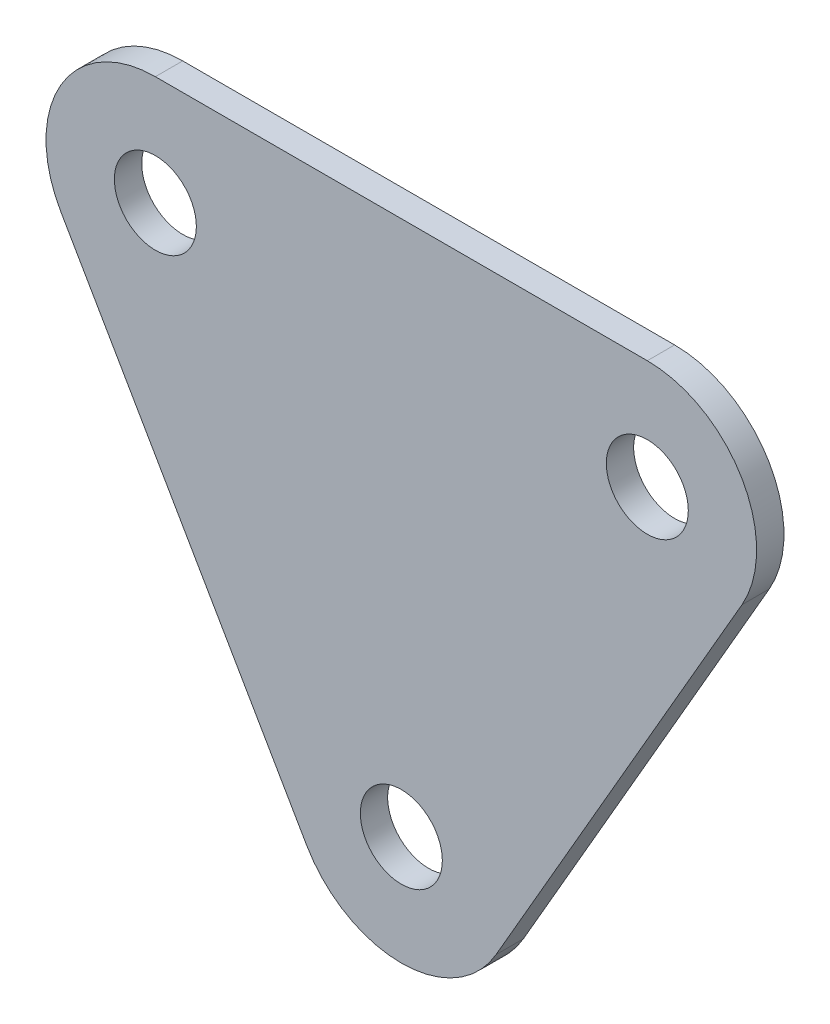
ISO-10303-21;
HEADER;
FILE_DESCRIPTION(('STEP AP214'),'2;1');
FILE_NAME('part.step','',(''),(''),'','','');
FILE_SCHEMA(('AUTOMOTIVE_DESIGN { 1 0 10303 214 1 1 1 1 }'));
ENDSEC;
DATA;
#1=APPLICATION_CONTEXT('core data for automotive mechanical design processes');
#2=APPLICATION_PROTOCOL_DEFINITION('international standard','automotive_design',2000,#1);
#3=PRODUCT_CONTEXT('',#1,'mechanical');
#4=PRODUCT('Part','Part','',(#3));
#5=PRODUCT_RELATED_PRODUCT_CATEGORY('part','',(#4));
#6=PRODUCT_DEFINITION_FORMATION('','',#4);
#7=PRODUCT_DEFINITION_CONTEXT('part definition',#1,'design');
#8=PRODUCT_DEFINITION('design','',#6,#7);
#9=PRODUCT_DEFINITION_SHAPE('','',#8);
#10=(LENGTH_UNIT() NAMED_UNIT(*) SI_UNIT(.MILLI.,.METRE.));
#11=(NAMED_UNIT(*) PLANE_ANGLE_UNIT() SI_UNIT($,.RADIAN.));
#12=(NAMED_UNIT(*) SI_UNIT($,.STERADIAN.) SOLID_ANGLE_UNIT());
#13=UNCERTAINTY_MEASURE_WITH_UNIT(LENGTH_MEASURE(1.E-05),#10,'distance_accuracy_value','');
#14=(GEOMETRIC_REPRESENTATION_CONTEXT(3) GLOBAL_UNCERTAINTY_ASSIGNED_CONTEXT((#13)) GLOBAL_UNIT_ASSIGNED_CONTEXT((#10,
#11,#12)) REPRESENTATION_CONTEXT('',''));
#15=CARTESIAN_POINT('',(0.,0.,0.));
#16=DIRECTION('',(0.,0.,1.));
#17=DIRECTION('',(1.,0.,0.));
#18=AXIS2_PLACEMENT_3D('',#15,#16,#17);
#19=CARTESIAN_POINT('',(-2.63677968348475E-13,-80.,20.));
#20=DIRECTION('',(0.,0.,-1.));
#21=DIRECTION('',(-1.,0.,0.));
#22=AXIS2_PLACEMENT_3D('',#19,#20,#21);
#23=PLANE('',#22);
#24=CARTESIAN_POINT('',(-2.63677968348475E-13,-80.,20.));
#25=DIRECTION('',(0.,0.,1.));
#26=DIRECTION('',(-1.,0.,0.));
#27=AXIS2_PLACEMENT_3D('',#24,#25,#26);
#28=CIRCLE('',#27,80.);
#29=CARTESIAN_POINT('',(0.,0.,20.));
#30=VERTEX_POINT('',#29);
#31=CARTESIAN_POINT('',(-69.2820323027554,-120.,20.));
#32=VERTEX_POINT('',#31);
#33=EDGE_CURVE('E129',#30,#32,#28,.T.);
#34=ORIENTED_EDGE('',*,*,#33,.T.);
#35=DIRECTION('',(0.5,-0.866025403784438,0.));
#36=VECTOR('',#35,1.);
#37=CARTESIAN_POINT('',(110.717967697245,-431.769145362398,20.));
#38=LINE('',#37,#36);
#39=CARTESIAN_POINT('',(110.717967697245,-431.769145362398,20.));
#40=VERTEX_POINT('',#39);
#41=EDGE_CURVE('E87',#32,#40,#38,.T.);
#42=ORIENTED_EDGE('',*,*,#41,.T.);
#43=CARTESIAN_POINT('',(180.,-391.769145362398,20.));
#44=DIRECTION('',(0.,0.,1.));
#45=DIRECTION('',(-1.,0.,0.));
#46=AXIS2_PLACEMENT_3D('',#43,#44,#45);
#47=CIRCLE('',#46,80.);
#48=CARTESIAN_POINT('',(249.282032302755,-431.769145362398,20.));
#49=VERTEX_POINT('',#48);
#50=EDGE_CURVE('E100',#40,#49,#47,.T.);
#51=ORIENTED_EDGE('',*,*,#50,.T.);
#52=DIRECTION('',(0.500000000000001,0.866025403784438,0.));
#53=VECTOR('',#52,1.);
#54=CARTESIAN_POINT('',(429.282032302755,-120.,20.));
#55=LINE('',#54,#53);
#56=CARTESIAN_POINT('',(429.282032302755,-120.,20.));
#57=VERTEX_POINT('',#56);
#58=EDGE_CURVE('E94',#49,#57,#55,.T.);
#59=ORIENTED_EDGE('',*,*,#58,.T.);
#60=CARTESIAN_POINT('',(360.,-80.,20.));
#61=DIRECTION('',(0.,0.,1.));
#62=DIRECTION('',(-1.,0.,0.));
#63=AXIS2_PLACEMENT_3D('',#60,#61,#62);
#64=CIRCLE('',#63,80.);
#65=CARTESIAN_POINT('',(360.,0.,20.));
#66=VERTEX_POINT('',#65);
#67=EDGE_CURVE('E98',#57,#66,#64,.T.);
#68=ORIENTED_EDGE('',*,*,#67,.T.);
#69=DIRECTION('',(-1.,0.,0.));
#70=VECTOR('',#69,1.);
#71=CARTESIAN_POINT('',(0.,0.,20.));
#72=LINE('',#71,#70);
#73=EDGE_CURVE('E50',#66,#30,#72,.T.);
#74=ORIENTED_EDGE('',*,*,#73,.T.);
#75=EDGE_LOOP('',(#34,#42,#51,#59,#68,#74));
#76=FACE_BOUND('',#75,.T.);
#77=CARTESIAN_POINT('',(-2.63677968348475E-13,-80.,20.));
#78=DIRECTION('',(0.,0.,1.));
#79=DIRECTION('',(1.,0.,0.));
#80=AXIS2_PLACEMENT_3D('',#77,#78,#79);
#81=CIRCLE('',#80,30.);
#82=CARTESIAN_POINT('',(29.9999999999997,-80.,20.));
#83=VERTEX_POINT('',#82);
#84=EDGE_CURVE('E122',#83,#83,#81,.T.);
#85=ORIENTED_EDGE('',*,*,#84,.F.);
#86=EDGE_LOOP('',(#85));
#87=FACE_BOUND('',#86,.T.);
#88=CARTESIAN_POINT('',(360.,-80.,20.));
#89=DIRECTION('',(0.,0.,1.));
#90=DIRECTION('',(1.,0.,0.));
#91=AXIS2_PLACEMENT_3D('',#88,#89,#90);
#92=CIRCLE('',#91,30.);
#93=CARTESIAN_POINT('',(390.,-80.,20.));
#94=VERTEX_POINT('',#93);
#95=EDGE_CURVE('E183',#94,#94,#92,.T.);
#96=ORIENTED_EDGE('',*,*,#95,.F.);
#97=EDGE_LOOP('',(#96));
#98=FACE_BOUND('',#97,.T.);
#99=CARTESIAN_POINT('',(180.,-391.769145362398,20.));
#100=DIRECTION('',(0.,0.,1.));
#101=DIRECTION('',(1.,0.,0.));
#102=AXIS2_PLACEMENT_3D('',#99,#100,#101);
#103=CIRCLE('',#102,30.);
#104=CARTESIAN_POINT('',(210.,-391.769145362398,20.));
#105=VERTEX_POINT('',#104);
#106=EDGE_CURVE('E174',#105,#105,#103,.T.);
#107=ORIENTED_EDGE('',*,*,#106,.F.);
#108=EDGE_LOOP('',(#107));
#109=FACE_BOUND('',#108,.T.);
#110=ADVANCED_FACE('F33',(#76,#87,#98,#109),#23,.F.);
#111=CARTESIAN_POINT('',(-2.63677968348475E-13,-80.,0.));
#112=DIRECTION('',(0.,0.,-1.));
#113=DIRECTION('',(-1.,0.,0.));
#114=AXIS2_PLACEMENT_3D('',#111,#112,#113);
#115=PLANE('',#114);
#116=CARTESIAN_POINT('',(360.,-80.,0.));
#117=DIRECTION('',(0.,0.,1.));
#118=DIRECTION('',(1.,0.,0.));
#119=AXIS2_PLACEMENT_3D('',#116,#117,#118);
#120=CIRCLE('',#119,30.);
#121=CARTESIAN_POINT('',(390.,-80.,0.));
#122=VERTEX_POINT('',#121);
#123=EDGE_CURVE('E180',#122,#122,#120,.T.);
#124=ORIENTED_EDGE('',*,*,#123,.T.);
#125=EDGE_LOOP('',(#124));
#126=FACE_BOUND('',#125,.T.);
#127=CARTESIAN_POINT('',(-2.63677968348475E-13,-80.,0.));
#128=DIRECTION('',(0.,0.,1.));
#129=DIRECTION('',(-1.,0.,0.));
#130=AXIS2_PLACEMENT_3D('',#127,#128,#129);
#131=CIRCLE('',#130,80.);
#132=CARTESIAN_POINT('',(0.,0.,0.));
#133=VERTEX_POINT('',#132);
#134=CARTESIAN_POINT('',(-69.2820323027554,-120.,0.));
#135=VERTEX_POINT('',#134);
#136=EDGE_CURVE('E118',#133,#135,#131,.T.);
#137=ORIENTED_EDGE('',*,*,#136,.F.);
#138=DIRECTION('',(-1.,0.,0.));
#139=VECTOR('',#138,1.);
#140=CARTESIAN_POINT('',(0.,0.,0.));
#141=LINE('',#140,#139);
#142=CARTESIAN_POINT('',(360.,0.,0.));
#143=VERTEX_POINT('',#142);
#144=EDGE_CURVE('E79',#143,#133,#141,.T.);
#145=ORIENTED_EDGE('',*,*,#144,.F.);
#146=CARTESIAN_POINT('',(360.,-80.,0.));
#147=DIRECTION('',(0.,0.,1.));
#148=DIRECTION('',(-1.,0.,0.));
#149=AXIS2_PLACEMENT_3D('',#146,#147,#148);
#150=CIRCLE('',#149,80.);
#151=CARTESIAN_POINT('',(429.282032302755,-120.,0.));
#152=VERTEX_POINT('',#151);
#153=EDGE_CURVE('E73',#152,#143,#150,.T.);
#154=ORIENTED_EDGE('',*,*,#153,.F.);
#155=DIRECTION('',(0.500000000000001,0.866025403784438,0.));
#156=VECTOR('',#155,1.);
#157=CARTESIAN_POINT('',(429.282032302755,-120.,0.));
#158=LINE('',#157,#156);
#159=CARTESIAN_POINT('',(249.282032302755,-431.769145362398,0.));
#160=VERTEX_POINT('',#159);
#161=EDGE_CURVE('E108',#160,#152,#158,.T.);
#162=ORIENTED_EDGE('',*,*,#161,.F.);
#163=CARTESIAN_POINT('',(180.,-391.769145362398,0.));
#164=DIRECTION('',(0.,0.,1.));
#165=DIRECTION('',(-1.,0.,0.));
#166=AXIS2_PLACEMENT_3D('',#163,#164,#165);
#167=CIRCLE('',#166,80.);
#168=CARTESIAN_POINT('',(110.717967697245,-431.769145362398,0.));
#169=VERTEX_POINT('',#168);
#170=EDGE_CURVE('E124',#169,#160,#167,.T.);
#171=ORIENTED_EDGE('',*,*,#170,.F.);
#172=DIRECTION('',(0.5,-0.866025403784438,0.));
#173=VECTOR('',#172,1.);
#174=CARTESIAN_POINT('',(110.717967697245,-431.769145362398,0.));
#175=LINE('',#174,#173);
#176=EDGE_CURVE('E121',#135,#169,#175,.T.);
#177=ORIENTED_EDGE('',*,*,#176,.F.);
#178=EDGE_LOOP('',(#137,#145,#154,#162,#171,#177));
#179=FACE_BOUND('',#178,.T.);
#180=CARTESIAN_POINT('',(-2.63677968348475E-13,-80.,0.));
#181=DIRECTION('',(0.,0.,1.));
#182=DIRECTION('',(1.,0.,0.));
#183=AXIS2_PLACEMENT_3D('',#180,#181,#182);
#184=CIRCLE('',#183,30.);
#185=CARTESIAN_POINT('',(29.9999999999997,-80.,0.));
#186=VERTEX_POINT('',#185);
#187=EDGE_CURVE('E186',#186,#186,#184,.T.);
#188=ORIENTED_EDGE('',*,*,#187,.T.);
#189=EDGE_LOOP('',(#188));
#190=FACE_BOUND('',#189,.T.);
#191=CARTESIAN_POINT('',(180.,-391.769145362398,0.));
#192=DIRECTION('',(0.,0.,1.));
#193=DIRECTION('',(1.,0.,0.));
#194=AXIS2_PLACEMENT_3D('',#191,#192,#193);
#195=CIRCLE('',#194,30.);
#196=CARTESIAN_POINT('',(210.,-391.769145362398,0.));
#197=VERTEX_POINT('',#196);
#198=EDGE_CURVE('E177',#197,#197,#195,.T.);
#199=ORIENTED_EDGE('',*,*,#198,.T.);
#200=EDGE_LOOP('',(#199));
#201=FACE_BOUND('',#200,.T.);
#202=ADVANCED_FACE('F138',(#126,#179,#190,#201),#115,.T.);
#203=CARTESIAN_POINT('',(-2.63677968348475E-13,-80.,20.));
#204=DIRECTION('',(0.,0.,-1.));
#205=DIRECTION('',(-1.,0.,0.));
#206=AXIS2_PLACEMENT_3D('',#203,#204,#205);
#207=CYLINDRICAL_SURFACE('',#206,80.);
#208=ORIENTED_EDGE('',*,*,#136,.T.);
#209=DIRECTION('',(0.,0.,-1.));
#210=VECTOR('',#209,1.);
#211=CARTESIAN_POINT('',(-69.2820323027554,-120.,20.));
#212=LINE('',#211,#210);
#213=EDGE_CURVE('E11',#32,#135,#212,.T.);
#214=ORIENTED_EDGE('',*,*,#213,.F.);
#215=ORIENTED_EDGE('',*,*,#33,.F.);
#216=DIRECTION('',(0.,0.,-1.));
#217=VECTOR('',#216,1.);
#218=CARTESIAN_POINT('',(0.,0.,20.));
#219=LINE('',#218,#217);
#220=EDGE_CURVE('E114',#30,#133,#219,.T.);
#221=ORIENTED_EDGE('',*,*,#220,.T.);
#222=EDGE_LOOP('',(#208,#214,#215,#221));
#223=FACE_BOUND('',#222,.T.);
#224=ADVANCED_FACE('F35',(#223),#207,.T.);
#225=CARTESIAN_POINT('',(110.717967697245,-431.769145362398,20.));
#226=DIRECTION('',(0.866025403784438,0.5,0.));
#227=DIRECTION('',(-0.5,0.866025403784438,0.));
#228=AXIS2_PLACEMENT_3D('',#225,#226,#227);
#229=PLANE('',#228);
#230=ORIENTED_EDGE('',*,*,#176,.T.);
#231=DIRECTION('',(0.,0.,-1.));
#232=VECTOR('',#231,1.);
#233=CARTESIAN_POINT('',(110.717967697245,-431.769145362398,20.));
#234=LINE('',#233,#232);
#235=EDGE_CURVE('E42',#40,#169,#234,.T.);
#236=ORIENTED_EDGE('',*,*,#235,.F.);
#237=ORIENTED_EDGE('',*,*,#41,.F.);
#238=ORIENTED_EDGE('',*,*,#213,.T.);
#239=EDGE_LOOP('',(#230,#236,#237,#238));
#240=FACE_BOUND('',#239,.T.);
#241=ADVANCED_FACE('F237',(#240),#229,.F.);
#242=CARTESIAN_POINT('',(180.,-391.769145362398,20.));
#243=DIRECTION('',(0.,0.,-1.));
#244=DIRECTION('',(-1.,0.,0.));
#245=AXIS2_PLACEMENT_3D('',#242,#243,#244);
#246=CYLINDRICAL_SURFACE('',#245,80.);
#247=ORIENTED_EDGE('',*,*,#170,.T.);
#248=DIRECTION('',(0.,0.,-1.));
#249=VECTOR('',#248,1.);
#250=CARTESIAN_POINT('',(249.282032302755,-431.769145362398,20.));
#251=LINE('',#250,#249);
#252=EDGE_CURVE('E109',#49,#160,#251,.T.);
#253=ORIENTED_EDGE('',*,*,#252,.F.);
#254=ORIENTED_EDGE('',*,*,#50,.F.);
#255=ORIENTED_EDGE('',*,*,#235,.T.);
#256=EDGE_LOOP('',(#247,#253,#254,#255));
#257=FACE_BOUND('',#256,.T.);
#258=ADVANCED_FACE('F135',(#257),#246,.T.);
#259=CARTESIAN_POINT('',(429.282032302755,-120.,20.));
#260=DIRECTION('',(-0.866025403784438,0.500000000000001,0.));
#261=DIRECTION('',(-0.500000000000001,-0.866025403784438,0.));
#262=AXIS2_PLACEMENT_3D('',#259,#260,#261);
#263=PLANE('',#262);
#264=ORIENTED_EDGE('',*,*,#161,.T.);
#265=DIRECTION('',(0.,0.,-1.));
#266=VECTOR('',#265,1.);
#267=CARTESIAN_POINT('',(429.282032302755,-120.,20.));
#268=LINE('',#267,#266);
#269=EDGE_CURVE('E105',#57,#152,#268,.T.);
#270=ORIENTED_EDGE('',*,*,#269,.F.);
#271=ORIENTED_EDGE('',*,*,#58,.F.);
#272=ORIENTED_EDGE('',*,*,#252,.T.);
#273=EDGE_LOOP('',(#264,#270,#271,#272));
#274=FACE_BOUND('',#273,.T.);
#275=ADVANCED_FACE('F106',(#274),#263,.F.);
#276=CARTESIAN_POINT('',(360.,-80.,20.));
#277=DIRECTION('',(0.,0.,-1.));
#278=DIRECTION('',(-1.,0.,0.));
#279=AXIS2_PLACEMENT_3D('',#276,#277,#278);
#280=CYLINDRICAL_SURFACE('',#279,80.);
#281=ORIENTED_EDGE('',*,*,#153,.T.);
#282=DIRECTION('',(0.,0.,-1.));
#283=VECTOR('',#282,1.);
#284=CARTESIAN_POINT('',(360.,0.,20.));
#285=LINE('',#284,#283);
#286=EDGE_CURVE('E110',#66,#143,#285,.T.);
#287=ORIENTED_EDGE('',*,*,#286,.F.);
#288=ORIENTED_EDGE('',*,*,#67,.F.);
#289=ORIENTED_EDGE('',*,*,#269,.T.);
#290=EDGE_LOOP('',(#281,#287,#288,#289));
#291=FACE_BOUND('',#290,.T.);
#292=ADVANCED_FACE('F112',(#291),#280,.T.);
#293=CARTESIAN_POINT('',(0.,0.,20.));
#294=DIRECTION('',(0.,-1.,0.));
#295=DIRECTION('',(0.,0.,-1.));
#296=AXIS2_PLACEMENT_3D('',#293,#294,#295);
#297=PLANE('',#296);
#298=ORIENTED_EDGE('',*,*,#144,.T.);
#299=ORIENTED_EDGE('',*,*,#220,.F.);
#300=ORIENTED_EDGE('',*,*,#73,.F.);
#301=ORIENTED_EDGE('',*,*,#286,.T.);
#302=EDGE_LOOP('',(#298,#299,#300,#301));
#303=FACE_BOUND('',#302,.T.);
#304=ADVANCED_FACE('F143',(#303),#297,.F.);
#305=CARTESIAN_POINT('',(-2.63677968348475E-13,-80.,20.));
#306=DIRECTION('',(0.,0.,-1.));
#307=DIRECTION('',(-1.,0.,0.));
#308=AXIS2_PLACEMENT_3D('',#305,#306,#307);
#309=CYLINDRICAL_SURFACE('',#308,30.);
#310=ORIENTED_EDGE('',*,*,#84,.T.);
#311=EDGE_LOOP('',(#310));
#312=FACE_BOUND('',#311,.T.);
#313=ORIENTED_EDGE('',*,*,#187,.F.);
#314=EDGE_LOOP('',(#313));
#315=FACE_BOUND('',#314,.T.);
#316=ADVANCED_FACE('F145',(#312,#315),#309,.F.);
#317=CARTESIAN_POINT('',(360.,-80.,20.));
#318=DIRECTION('',(0.,0.,-1.));
#319=DIRECTION('',(-1.,0.,0.));
#320=AXIS2_PLACEMENT_3D('',#317,#318,#319);
#321=CYLINDRICAL_SURFACE('',#320,30.);
#322=ORIENTED_EDGE('',*,*,#95,.T.);
#323=EDGE_LOOP('',(#322));
#324=FACE_BOUND('',#323,.T.);
#325=ORIENTED_EDGE('',*,*,#123,.F.);
#326=EDGE_LOOP('',(#325));
#327=FACE_BOUND('',#326,.T.);
#328=ADVANCED_FACE('F151',(#324,#327),#321,.F.);
#329=CARTESIAN_POINT('',(180.,-391.769145362398,20.));
#330=DIRECTION('',(0.,0.,-1.));
#331=DIRECTION('',(-1.,0.,0.));
#332=AXIS2_PLACEMENT_3D('',#329,#330,#331);
#333=CYLINDRICAL_SURFACE('',#332,30.);
#334=ORIENTED_EDGE('',*,*,#106,.T.);
#335=EDGE_LOOP('',(#334));
#336=FACE_BOUND('',#335,.T.);
#337=ORIENTED_EDGE('',*,*,#198,.F.);
#338=EDGE_LOOP('',(#337));
#339=FACE_BOUND('',#338,.T.);
#340=ADVANCED_FACE('F165',(#336,#339),#333,.F.);
#341=CLOSED_SHELL('',(#110,#202,#224,#241,#258,#275,#292,#304,#316,#328,#340));
#342=MANIFOLD_SOLID_BREP('B2',#341);
#343=ADVANCED_BREP_SHAPE_REPRESENTATION('',(#18,#342),#14);
#344=SHAPE_DEFINITION_REPRESENTATION(#9,#343);
ENDSEC;
END-ISO-10303-21;
